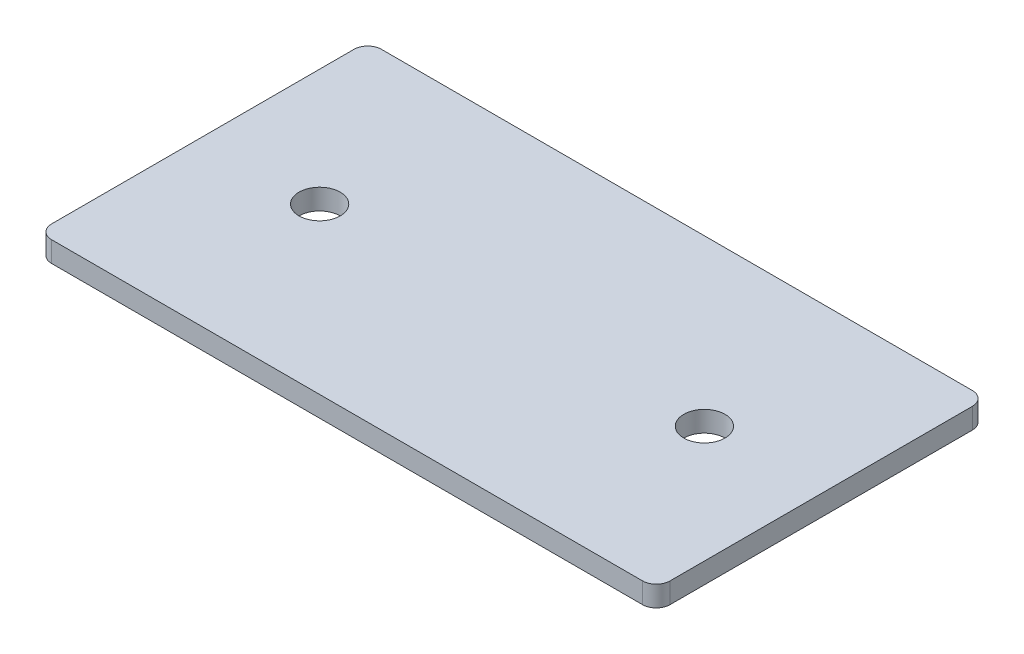
ISO-10303-21;
HEADER;
FILE_DESCRIPTION(('STEP AP214'),'2;1');
FILE_NAME('part.step','',(''),(''),'','','');
FILE_SCHEMA(('AUTOMOTIVE_DESIGN { 1 0 10303 214 1 1 1 1 }'));
ENDSEC;
DATA;
#1=APPLICATION_CONTEXT('core data for automotive mechanical design processes');
#2=APPLICATION_PROTOCOL_DEFINITION('international standard','automotive_design',2000,#1);
#3=PRODUCT_CONTEXT('',#1,'mechanical');
#4=PRODUCT('Part','Part','',(#3));
#5=PRODUCT_RELATED_PRODUCT_CATEGORY('part','',(#4));
#6=PRODUCT_DEFINITION_FORMATION('','',#4);
#7=PRODUCT_DEFINITION_CONTEXT('part definition',#1,'design');
#8=PRODUCT_DEFINITION('design','',#6,#7);
#9=PRODUCT_DEFINITION_SHAPE('','',#8);
#10=(LENGTH_UNIT() NAMED_UNIT(*) SI_UNIT(.MILLI.,.METRE.));
#11=(NAMED_UNIT(*) PLANE_ANGLE_UNIT() SI_UNIT($,.RADIAN.));
#12=(NAMED_UNIT(*) SI_UNIT($,.STERADIAN.) SOLID_ANGLE_UNIT());
#13=UNCERTAINTY_MEASURE_WITH_UNIT(LENGTH_MEASURE(1.E-05),#10,'distance_accuracy_value','');
#14=(GEOMETRIC_REPRESENTATION_CONTEXT(3) GLOBAL_UNCERTAINTY_ASSIGNED_CONTEXT((#13)) GLOBAL_UNIT_ASSIGNED_CONTEXT((#10,
#11,#12)) REPRESENTATION_CONTEXT('',''));
#15=CARTESIAN_POINT('',(0.,0.,0.));
#16=DIRECTION('',(0.,0.,1.));
#17=DIRECTION('',(1.,0.,0.));
#18=AXIS2_PLACEMENT_3D('',#15,#16,#17);
#19=CARTESIAN_POINT('',(22.5,1.5,12.));
#20=DIRECTION('',(-1.,0.,0.));
#21=DIRECTION('',(0.,0.,1.));
#22=AXIS2_PLACEMENT_3D('',#19,#20,#21);
#23=PLANE('',#22);
#24=DIRECTION('',(0.,0.,-1.));
#25=VECTOR('',#24,1.);
#26=CARTESIAN_POINT('',(22.5,0.,12.));
#27=LINE('',#26,#25);
#28=CARTESIAN_POINT('',(22.5,0.,11.));
#29=VERTEX_POINT('',#28);
#30=CARTESIAN_POINT('',(22.5,0.,-11.));
#31=VERTEX_POINT('',#30);
#32=EDGE_CURVE('E145',#29,#31,#27,.T.);
#33=ORIENTED_EDGE('',*,*,#32,.T.);
#34=DIRECTION('',(0.,-1.,0.));
#35=VECTOR('',#34,1.);
#36=CARTESIAN_POINT('',(22.5,1.5,-11.));
#37=LINE('',#36,#35);
#38=CARTESIAN_POINT('',(22.5,1.5,-11.));
#39=VERTEX_POINT('',#38);
#40=EDGE_CURVE('E11',#31,#39,#37,.F.);
#41=ORIENTED_EDGE('',*,*,#40,.T.);
#42=DIRECTION('',(0.,0.,-1.));
#43=VECTOR('',#42,1.);
#44=CARTESIAN_POINT('',(22.5,1.5,12.));
#45=LINE('',#44,#43);
#46=CARTESIAN_POINT('',(22.5,1.5,11.));
#47=VERTEX_POINT('',#46);
#48=EDGE_CURVE('E143',#47,#39,#45,.T.);
#49=ORIENTED_EDGE('',*,*,#48,.F.);
#50=DIRECTION('',(0.,-1.,0.));
#51=VECTOR('',#50,1.);
#52=CARTESIAN_POINT('',(22.5,1.5,11.));
#53=LINE('',#52,#51);
#54=EDGE_CURVE('E52',#47,#29,#53,.T.);
#55=ORIENTED_EDGE('',*,*,#54,.T.);
#56=EDGE_LOOP('',(#33,#41,#49,#55));
#57=FACE_BOUND('',#56,.T.);
#58=ADVANCED_FACE('F43',(#57),#23,.F.);
#59=CARTESIAN_POINT('',(-22.5,1.5,-12.));
#60=DIRECTION('',(0.,0.,1.));
#61=DIRECTION('',(1.,0.,0.));
#62=AXIS2_PLACEMENT_3D('',#59,#60,#61);
#63=PLANE('',#62);
#64=DIRECTION('',(-1.,0.,0.));
#65=VECTOR('',#64,1.);
#66=CARTESIAN_POINT('',(-22.5,0.,-12.));
#67=LINE('',#66,#65);
#68=CARTESIAN_POINT('',(21.5,0.,-12.));
#69=VERTEX_POINT('',#68);
#70=CARTESIAN_POINT('',(-21.5,0.,-12.));
#71=VERTEX_POINT('',#70);
#72=EDGE_CURVE('E139',#69,#71,#67,.T.);
#73=ORIENTED_EDGE('',*,*,#72,.T.);
#74=DIRECTION('',(0.,-1.,0.));
#75=VECTOR('',#74,1.);
#76=CARTESIAN_POINT('',(-21.5,1.5,-12.));
#77=LINE('',#76,#75);
#78=CARTESIAN_POINT('',(-21.5,1.5,-12.));
#79=VERTEX_POINT('',#78);
#80=EDGE_CURVE('E115',#71,#79,#77,.F.);
#81=ORIENTED_EDGE('',*,*,#80,.T.);
#82=DIRECTION('',(-1.,0.,0.));
#83=VECTOR('',#82,1.);
#84=CARTESIAN_POINT('',(-22.5,1.5,-12.));
#85=LINE('',#84,#83);
#86=CARTESIAN_POINT('',(21.5,1.5,-12.));
#87=VERTEX_POINT('',#86);
#88=EDGE_CURVE('E202',#87,#79,#85,.T.);
#89=ORIENTED_EDGE('',*,*,#88,.F.);
#90=DIRECTION('',(0.,-1.,0.));
#91=VECTOR('',#90,1.);
#92=CARTESIAN_POINT('',(21.5,1.5,-12.));
#93=LINE('',#92,#91);
#94=EDGE_CURVE('E121',#87,#69,#93,.T.);
#95=ORIENTED_EDGE('',*,*,#94,.T.);
#96=EDGE_LOOP('',(#73,#81,#89,#95));
#97=FACE_BOUND('',#96,.T.);
#98=ADVANCED_FACE('F239',(#97),#63,.F.);
#99=CARTESIAN_POINT('',(-22.5,1.5,12.));
#100=DIRECTION('',(1.,0.,0.));
#101=DIRECTION('',(0.,0.,-1.));
#102=AXIS2_PLACEMENT_3D('',#99,#100,#101);
#103=PLANE('',#102);
#104=DIRECTION('',(0.,0.,1.));
#105=VECTOR('',#104,1.);
#106=CARTESIAN_POINT('',(-22.5,1.5,12.));
#107=LINE('',#106,#105);
#108=CARTESIAN_POINT('',(-22.5,1.5,-11.));
#109=VERTEX_POINT('',#108);
#110=CARTESIAN_POINT('',(-22.5,1.5,11.));
#111=VERTEX_POINT('',#110);
#112=EDGE_CURVE('E130',#109,#111,#107,.T.);
#113=ORIENTED_EDGE('',*,*,#112,.F.);
#114=DIRECTION('',(0.,-1.,0.));
#115=VECTOR('',#114,1.);
#116=CARTESIAN_POINT('',(-22.5,1.5,-11.));
#117=LINE('',#116,#115);
#118=CARTESIAN_POINT('',(-22.5,0.,-11.));
#119=VERTEX_POINT('',#118);
#120=EDGE_CURVE('E114',#109,#119,#117,.T.);
#121=ORIENTED_EDGE('',*,*,#120,.T.);
#122=DIRECTION('',(0.,0.,1.));
#123=VECTOR('',#122,1.);
#124=CARTESIAN_POINT('',(-22.5,0.,12.));
#125=LINE('',#124,#123);
#126=CARTESIAN_POINT('',(-22.5,0.,11.));
#127=VERTEX_POINT('',#126);
#128=EDGE_CURVE('E128',#119,#127,#125,.T.);
#129=ORIENTED_EDGE('',*,*,#128,.T.);
#130=DIRECTION('',(0.,-1.,0.));
#131=VECTOR('',#130,1.);
#132=CARTESIAN_POINT('',(-22.5,1.5,11.));
#133=LINE('',#132,#131);
#134=EDGE_CURVE('E133',#127,#111,#133,.F.);
#135=ORIENTED_EDGE('',*,*,#134,.T.);
#136=EDGE_LOOP('',(#113,#121,#129,#135));
#137=FACE_BOUND('',#136,.T.);
#138=ADVANCED_FACE('F127',(#137),#103,.F.);
#139=CARTESIAN_POINT('',(-22.5,1.5,12.));
#140=DIRECTION('',(0.,0.,-1.));
#141=DIRECTION('',(-1.,0.,0.));
#142=AXIS2_PLACEMENT_3D('',#139,#140,#141);
#143=PLANE('',#142);
#144=DIRECTION('',(1.,0.,0.));
#145=VECTOR('',#144,1.);
#146=CARTESIAN_POINT('',(-22.5,1.5,12.));
#147=LINE('',#146,#145);
#148=CARTESIAN_POINT('',(-21.5,1.5,12.));
#149=VERTEX_POINT('',#148);
#150=CARTESIAN_POINT('',(21.5,1.5,12.));
#151=VERTEX_POINT('',#150);
#152=EDGE_CURVE('E150',#149,#151,#147,.T.);
#153=ORIENTED_EDGE('',*,*,#152,.F.);
#154=DIRECTION('',(0.,-1.,0.));
#155=VECTOR('',#154,1.);
#156=CARTESIAN_POINT('',(-21.5,1.5,12.));
#157=LINE('',#156,#155);
#158=CARTESIAN_POINT('',(-21.5,0.,12.));
#159=VERTEX_POINT('',#158);
#160=EDGE_CURVE('E177',#149,#159,#157,.T.);
#161=ORIENTED_EDGE('',*,*,#160,.T.);
#162=DIRECTION('',(1.,0.,0.));
#163=VECTOR('',#162,1.);
#164=CARTESIAN_POINT('',(-22.5,0.,12.));
#165=LINE('',#164,#163);
#166=CARTESIAN_POINT('',(21.5,0.,12.));
#167=VERTEX_POINT('',#166);
#168=EDGE_CURVE('E138',#159,#167,#165,.T.);
#169=ORIENTED_EDGE('',*,*,#168,.T.);
#170=DIRECTION('',(0.,-1.,0.));
#171=VECTOR('',#170,1.);
#172=CARTESIAN_POINT('',(21.5,1.5,12.));
#173=LINE('',#172,#171);
#174=EDGE_CURVE('E59',#167,#151,#173,.F.);
#175=ORIENTED_EDGE('',*,*,#174,.T.);
#176=EDGE_LOOP('',(#153,#161,#169,#175));
#177=FACE_BOUND('',#176,.T.);
#178=ADVANCED_FACE('F232',(#177),#143,.F.);
#179=CARTESIAN_POINT('',(0.,1.5,0.));
#180=DIRECTION('',(0.,-1.,0.));
#181=DIRECTION('',(0.,0.,-1.));
#182=AXIS2_PLACEMENT_3D('',#179,#180,#181);
#183=PLANE('',#182);
#184=CARTESIAN_POINT('',(-14.,1.5,0.));
#185=DIRECTION('',(0.,1.,0.));
#186=DIRECTION('',(0.,0.,1.));
#187=AXIS2_PLACEMENT_3D('',#184,#185,#186);
#188=CIRCLE('',#187,1.5);
#189=CARTESIAN_POINT('',(-14.,1.5,1.5));
#190=VERTEX_POINT('',#189);
#191=EDGE_CURVE('E192',#190,#190,#188,.T.);
#192=ORIENTED_EDGE('',*,*,#191,.F.);
#193=EDGE_LOOP('',(#192));
#194=FACE_BOUND('',#193,.T.);
#195=CARTESIAN_POINT('',(14.,1.5,0.));
#196=DIRECTION('',(0.,1.,0.));
#197=DIRECTION('',(0.,0.,-1.));
#198=AXIS2_PLACEMENT_3D('',#195,#196,#197);
#199=CIRCLE('',#198,1.5);
#200=CARTESIAN_POINT('',(14.,1.5,-1.5));
#201=VERTEX_POINT('',#200);
#202=EDGE_CURVE('E208',#201,#201,#199,.T.);
#203=ORIENTED_EDGE('',*,*,#202,.F.);
#204=EDGE_LOOP('',(#203));
#205=FACE_BOUND('',#204,.T.);
#206=ORIENTED_EDGE('',*,*,#88,.T.);
#207=CARTESIAN_POINT('',(-21.5,1.5,-11.));
#208=DIRECTION('',(0.,-1.,0.));
#209=DIRECTION('',(0.,0.,-1.));
#210=AXIS2_PLACEMENT_3D('',#207,#208,#209);
#211=CIRCLE('',#210,1.);
#212=EDGE_CURVE('E172',#79,#109,#211,.F.);
#213=ORIENTED_EDGE('',*,*,#212,.T.);
#214=ORIENTED_EDGE('',*,*,#112,.T.);
#215=CARTESIAN_POINT('',(-21.5,1.5,11.));
#216=DIRECTION('',(0.,-1.,0.));
#217=DIRECTION('',(0.,0.,-1.));
#218=AXIS2_PLACEMENT_3D('',#215,#216,#217);
#219=CIRCLE('',#218,1.);
#220=EDGE_CURVE('E66',#111,#149,#219,.F.);
#221=ORIENTED_EDGE('',*,*,#220,.T.);
#222=ORIENTED_EDGE('',*,*,#152,.T.);
#223=CARTESIAN_POINT('',(21.5,1.5,11.));
#224=DIRECTION('',(0.,-1.,0.));
#225=DIRECTION('',(0.,0.,-1.));
#226=AXIS2_PLACEMENT_3D('',#223,#224,#225);
#227=CIRCLE('',#226,1.);
#228=EDGE_CURVE('E164',#151,#47,#227,.F.);
#229=ORIENTED_EDGE('',*,*,#228,.T.);
#230=ORIENTED_EDGE('',*,*,#48,.T.);
#231=CARTESIAN_POINT('',(21.5,1.5,-11.));
#232=DIRECTION('',(0.,-1.,0.));
#233=DIRECTION('',(0.,0.,-1.));
#234=AXIS2_PLACEMENT_3D('',#231,#232,#233);
#235=CIRCLE('',#234,1.);
#236=EDGE_CURVE('E167',#39,#87,#235,.F.);
#237=ORIENTED_EDGE('',*,*,#236,.T.);
#238=EDGE_LOOP('',(#206,#213,#214,#221,#222,#229,#230,#237));
#239=FACE_BOUND('',#238,.T.);
#240=ADVANCED_FACE('F229',(#194,#205,#239),#183,.F.);
#241=CARTESIAN_POINT('',(0.,0.,0.));
#242=DIRECTION('',(0.,-1.,0.));
#243=DIRECTION('',(0.,0.,-1.));
#244=AXIS2_PLACEMENT_3D('',#241,#242,#243);
#245=PLANE('',#244);
#246=CARTESIAN_POINT('',(-14.,0.,0.));
#247=DIRECTION('',(0.,-1.,0.));
#248=DIRECTION('',(0.,0.,-1.));
#249=AXIS2_PLACEMENT_3D('',#246,#247,#248);
#250=CIRCLE('',#249,1.5);
#251=CARTESIAN_POINT('',(-14.,0.,-1.5));
#252=VERTEX_POINT('',#251);
#253=EDGE_CURVE('E195',#252,#252,#250,.F.);
#254=ORIENTED_EDGE('',*,*,#253,.T.);
#255=EDGE_LOOP('',(#254));
#256=FACE_BOUND('',#255,.T.);
#257=CARTESIAN_POINT('',(14.,0.,0.));
#258=DIRECTION('',(0.,-1.,0.));
#259=DIRECTION('',(0.,0.,-1.));
#260=AXIS2_PLACEMENT_3D('',#257,#258,#259);
#261=CIRCLE('',#260,1.5);
#262=CARTESIAN_POINT('',(14.,0.,-1.5));
#263=VERTEX_POINT('',#262);
#264=EDGE_CURVE('E212',#263,#263,#261,.F.);
#265=ORIENTED_EDGE('',*,*,#264,.T.);
#266=EDGE_LOOP('',(#265));
#267=FACE_BOUND('',#266,.T.);
#268=ORIENTED_EDGE('',*,*,#128,.F.);
#269=CARTESIAN_POINT('',(-21.5,0.,-11.));
#270=DIRECTION('',(0.,-1.,0.));
#271=DIRECTION('',(0.,0.,-1.));
#272=AXIS2_PLACEMENT_3D('',#269,#270,#271);
#273=CIRCLE('',#272,1.);
#274=EDGE_CURVE('E110',#119,#71,#273,.T.);
#275=ORIENTED_EDGE('',*,*,#274,.T.);
#276=ORIENTED_EDGE('',*,*,#72,.F.);
#277=CARTESIAN_POINT('',(21.5,0.,-11.));
#278=DIRECTION('',(0.,-1.,0.));
#279=DIRECTION('',(0.,0.,-1.));
#280=AXIS2_PLACEMENT_3D('',#277,#278,#279);
#281=CIRCLE('',#280,1.);
#282=EDGE_CURVE('E154',#69,#31,#281,.T.);
#283=ORIENTED_EDGE('',*,*,#282,.T.);
#284=ORIENTED_EDGE('',*,*,#32,.F.);
#285=CARTESIAN_POINT('',(21.5,0.,11.));
#286=DIRECTION('',(0.,-1.,0.));
#287=DIRECTION('',(0.,0.,-1.));
#288=AXIS2_PLACEMENT_3D('',#285,#286,#287);
#289=CIRCLE('',#288,1.);
#290=EDGE_CURVE('E132',#29,#167,#289,.T.);
#291=ORIENTED_EDGE('',*,*,#290,.T.);
#292=ORIENTED_EDGE('',*,*,#168,.F.);
#293=CARTESIAN_POINT('',(-21.5,0.,11.));
#294=DIRECTION('',(0.,-1.,0.));
#295=DIRECTION('',(0.,0.,-1.));
#296=AXIS2_PLACEMENT_3D('',#293,#294,#295);
#297=CIRCLE('',#296,1.);
#298=EDGE_CURVE('E122',#159,#127,#297,.T.);
#299=ORIENTED_EDGE('',*,*,#298,.T.);
#300=EDGE_LOOP('',(#268,#275,#276,#283,#284,#291,#292,#299));
#301=FACE_BOUND('',#300,.T.);
#302=ADVANCED_FACE('F135',(#256,#267,#301),#245,.T.);
#303=CARTESIAN_POINT('',(-21.5,1.5,-11.));
#304=DIRECTION('',(0.,-1.,0.));
#305=DIRECTION('',(0.,0.,-1.));
#306=AXIS2_PLACEMENT_3D('',#303,#304,#305);
#307=CYLINDRICAL_SURFACE('',#306,1.);
#308=ORIENTED_EDGE('',*,*,#212,.F.);
#309=ORIENTED_EDGE('',*,*,#80,.F.);
#310=ORIENTED_EDGE('',*,*,#274,.F.);
#311=ORIENTED_EDGE('',*,*,#120,.F.);
#312=EDGE_LOOP('',(#308,#309,#310,#311));
#313=FACE_BOUND('',#312,.T.);
#314=ADVANCED_FACE('F113',(#313),#307,.T.);
#315=CARTESIAN_POINT('',(-21.5,1.5,11.));
#316=DIRECTION('',(0.,-1.,0.));
#317=DIRECTION('',(0.,0.,-1.));
#318=AXIS2_PLACEMENT_3D('',#315,#316,#317);
#319=CYLINDRICAL_SURFACE('',#318,1.);
#320=ORIENTED_EDGE('',*,*,#220,.F.);
#321=ORIENTED_EDGE('',*,*,#134,.F.);
#322=ORIENTED_EDGE('',*,*,#298,.F.);
#323=ORIENTED_EDGE('',*,*,#160,.F.);
#324=EDGE_LOOP('',(#320,#321,#322,#323));
#325=FACE_BOUND('',#324,.T.);
#326=ADVANCED_FACE('F249',(#325),#319,.T.);
#327=CARTESIAN_POINT('',(21.5,1.5,-11.));
#328=DIRECTION('',(0.,-1.,0.));
#329=DIRECTION('',(0.,0.,-1.));
#330=AXIS2_PLACEMENT_3D('',#327,#328,#329);
#331=CYLINDRICAL_SURFACE('',#330,1.);
#332=ORIENTED_EDGE('',*,*,#236,.F.);
#333=ORIENTED_EDGE('',*,*,#40,.F.);
#334=ORIENTED_EDGE('',*,*,#282,.F.);
#335=ORIENTED_EDGE('',*,*,#94,.F.);
#336=EDGE_LOOP('',(#332,#333,#334,#335));
#337=FACE_BOUND('',#336,.T.);
#338=ADVANCED_FACE('F241',(#337),#331,.T.);
#339=CARTESIAN_POINT('',(21.5,1.5,11.));
#340=DIRECTION('',(0.,-1.,0.));
#341=DIRECTION('',(0.,0.,-1.));
#342=AXIS2_PLACEMENT_3D('',#339,#340,#341);
#343=CYLINDRICAL_SURFACE('',#342,1.);
#344=ORIENTED_EDGE('',*,*,#228,.F.);
#345=ORIENTED_EDGE('',*,*,#174,.F.);
#346=ORIENTED_EDGE('',*,*,#290,.F.);
#347=ORIENTED_EDGE('',*,*,#54,.F.);
#348=EDGE_LOOP('',(#344,#345,#346,#347));
#349=FACE_BOUND('',#348,.T.);
#350=ADVANCED_FACE('F45',(#349),#343,.T.);
#351=CARTESIAN_POINT('',(14.,-0.000999999999999916,0.));
#352=DIRECTION('',(0.,1.,0.));
#353=DIRECTION('',(0.,0.,1.));
#354=AXIS2_PLACEMENT_3D('',#351,#352,#353);
#355=CYLINDRICAL_SURFACE('',#354,1.5);
#356=ORIENTED_EDGE('',*,*,#264,.F.);
#357=EDGE_LOOP('',(#356));
#358=FACE_BOUND('',#357,.T.);
#359=ORIENTED_EDGE('',*,*,#202,.T.);
#360=EDGE_LOOP('',(#359));
#361=FACE_BOUND('',#360,.T.);
#362=ADVANCED_FACE('F225',(#358,#361),#355,.F.);
#363=CARTESIAN_POINT('',(-14.,-0.000999999999999916,0.));
#364=DIRECTION('',(0.,1.,0.));
#365=DIRECTION('',(0.,0.,1.));
#366=AXIS2_PLACEMENT_3D('',#363,#364,#365);
#367=CYLINDRICAL_SURFACE('',#366,1.5);
#368=ORIENTED_EDGE('',*,*,#253,.F.);
#369=EDGE_LOOP('',(#368));
#370=FACE_BOUND('',#369,.T.);
#371=ORIENTED_EDGE('',*,*,#191,.T.);
#372=EDGE_LOOP('',(#371));
#373=FACE_BOUND('',#372,.T.);
#374=ADVANCED_FACE('F222',(#370,#373),#367,.F.);
#375=CLOSED_SHELL('',(#58,#98,#138,#178,#240,#302,#314,#326,#338,#350,#362,#374));
#376=MANIFOLD_SOLID_BREP('B2',#375);
#377=ADVANCED_BREP_SHAPE_REPRESENTATION('',(#18,#376),#14);
#378=SHAPE_DEFINITION_REPRESENTATION(#9,#377);
ENDSEC;
END-ISO-10303-21;
